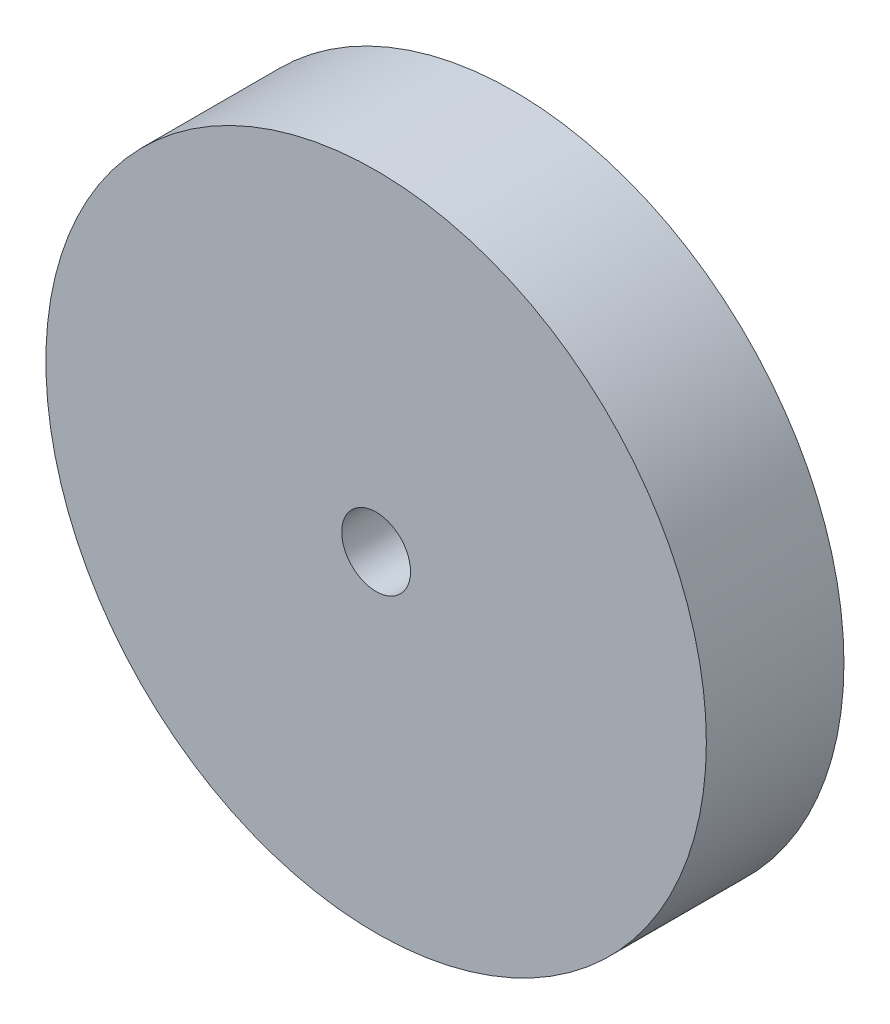
ISO-10303-21;
HEADER;
FILE_DESCRIPTION(('STEP AP214'),'2;1');
FILE_NAME('part.step','',(''),(''),'','','');
FILE_SCHEMA(('AUTOMOTIVE_DESIGN { 1 0 10303 214 1 1 1 1 }'));
ENDSEC;
DATA;
#1=APPLICATION_CONTEXT('core data for automotive mechanical design processes');
#2=APPLICATION_PROTOCOL_DEFINITION('international standard','automotive_design',2000,#1);
#3=PRODUCT_CONTEXT('',#1,'mechanical');
#4=PRODUCT('Part','Part','',(#3));
#5=PRODUCT_RELATED_PRODUCT_CATEGORY('part','',(#4));
#6=PRODUCT_DEFINITION_FORMATION('','',#4);
#7=PRODUCT_DEFINITION_CONTEXT('part definition',#1,'design');
#8=PRODUCT_DEFINITION('design','',#6,#7);
#9=PRODUCT_DEFINITION_SHAPE('','',#8);
#10=(LENGTH_UNIT() NAMED_UNIT(*) SI_UNIT(.MILLI.,.METRE.));
#11=(NAMED_UNIT(*) PLANE_ANGLE_UNIT() SI_UNIT($,.RADIAN.));
#12=(NAMED_UNIT(*) SI_UNIT($,.STERADIAN.) SOLID_ANGLE_UNIT());
#13=UNCERTAINTY_MEASURE_WITH_UNIT(LENGTH_MEASURE(1.E-05),#10,'distance_accuracy_value','');
#14=(GEOMETRIC_REPRESENTATION_CONTEXT(3) GLOBAL_UNCERTAINTY_ASSIGNED_CONTEXT((#13)) GLOBAL_UNIT_ASSIGNED_CONTEXT((#10,
#11,#12)) REPRESENTATION_CONTEXT('',''));
#15=CARTESIAN_POINT('',(0.,0.,0.));
#16=DIRECTION('',(0.,0.,1.));
#17=DIRECTION('',(1.,0.,0.));
#18=AXIS2_PLACEMENT_3D('',#15,#16,#17);
#19=CARTESIAN_POINT('',(0.,0.,6.35));
#20=DIRECTION('',(0.,0.,1.));
#21=DIRECTION('',(1.,0.,0.));
#22=AXIS2_PLACEMENT_3D('',#19,#20,#21);
#23=PLANE('',#22);
#24=CARTESIAN_POINT('',(0.,0.,6.35));
#25=DIRECTION('',(0.,0.,1.));
#26=DIRECTION('',(1.,0.,0.));
#27=AXIS2_PLACEMENT_3D('',#24,#25,#26);
#28=CIRCLE('',#27,15.24);
#29=CARTESIAN_POINT('',(15.24,0.,6.35));
#30=VERTEX_POINT('',#29);
#31=EDGE_CURVE('E10',#30,#30,#28,.T.);
#32=ORIENTED_EDGE('',*,*,#31,.T.);
#33=EDGE_LOOP('',(#32));
#34=FACE_BOUND('',#33,.T.);
#35=CARTESIAN_POINT('',(0.,0.,6.35));
#36=DIRECTION('',(0.,0.,1.));
#37=DIRECTION('',(1.,0.,0.));
#38=AXIS2_PLACEMENT_3D('',#35,#36,#37);
#39=CIRCLE('',#38,1.5875);
#40=CARTESIAN_POINT('',(1.5875,0.,6.35));
#41=VERTEX_POINT('',#40);
#42=EDGE_CURVE('E50',#41,#41,#39,.T.);
#43=ORIENTED_EDGE('',*,*,#42,.F.);
#44=EDGE_LOOP('',(#43));
#45=FACE_BOUND('',#44,.T.);
#46=ADVANCED_FACE('F37',(#34,#45),#23,.T.);
#47=CARTESIAN_POINT('',(0.,0.,0.));
#48=DIRECTION('',(0.,0.,1.));
#49=DIRECTION('',(1.,0.,0.));
#50=AXIS2_PLACEMENT_3D('',#47,#48,#49);
#51=PLANE('',#50);
#52=CARTESIAN_POINT('',(0.,0.,0.));
#53=DIRECTION('',(0.,0.,1.));
#54=DIRECTION('',(1.,0.,0.));
#55=AXIS2_PLACEMENT_3D('',#52,#53,#54);
#56=CIRCLE('',#55,15.24);
#57=CARTESIAN_POINT('',(15.24,0.,0.));
#58=VERTEX_POINT('',#57);
#59=EDGE_CURVE('E41',#58,#58,#56,.T.);
#60=ORIENTED_EDGE('',*,*,#59,.F.);
#61=EDGE_LOOP('',(#60));
#62=FACE_BOUND('',#61,.T.);
#63=CARTESIAN_POINT('',(0.,0.,0.));
#64=DIRECTION('',(0.,0.,1.));
#65=DIRECTION('',(1.,0.,0.));
#66=AXIS2_PLACEMENT_3D('',#63,#64,#65);
#67=CIRCLE('',#66,1.5875);
#68=CARTESIAN_POINT('',(1.5875,0.,0.));
#69=VERTEX_POINT('',#68);
#70=EDGE_CURVE('E52',#69,#69,#67,.T.);
#71=ORIENTED_EDGE('',*,*,#70,.T.);
#72=EDGE_LOOP('',(#71));
#73=FACE_BOUND('',#72,.T.);
#74=ADVANCED_FACE('F64',(#62,#73),#51,.F.);
#75=CARTESIAN_POINT('',(0.,0.,6.35));
#76=DIRECTION('',(0.,0.,-1.));
#77=DIRECTION('',(-1.,0.,0.));
#78=AXIS2_PLACEMENT_3D('',#75,#76,#77);
#79=CYLINDRICAL_SURFACE('',#78,15.24);
#80=ORIENTED_EDGE('',*,*,#31,.F.);
#81=EDGE_LOOP('',(#80));
#82=FACE_BOUND('',#81,.T.);
#83=ORIENTED_EDGE('',*,*,#59,.T.);
#84=EDGE_LOOP('',(#83));
#85=FACE_BOUND('',#84,.T.);
#86=ADVANCED_FACE('F39',(#82,#85),#79,.T.);
#87=CARTESIAN_POINT('',(0.,0.,6.35));
#88=DIRECTION('',(0.,0.,-1.));
#89=DIRECTION('',(-1.,0.,0.));
#90=AXIS2_PLACEMENT_3D('',#87,#88,#89);
#91=CYLINDRICAL_SURFACE('',#90,1.5875);
#92=ORIENTED_EDGE('',*,*,#42,.T.);
#93=EDGE_LOOP('',(#92));
#94=FACE_BOUND('',#93,.T.);
#95=ORIENTED_EDGE('',*,*,#70,.F.);
#96=EDGE_LOOP('',(#95));
#97=FACE_BOUND('',#96,.T.);
#98=ADVANCED_FACE('F60',(#94,#97),#91,.F.);
#99=CLOSED_SHELL('',(#46,#74,#86,#98));
#100=MANIFOLD_SOLID_BREP('B2',#99);
#101=ADVANCED_BREP_SHAPE_REPRESENTATION('',(#18,#100),#14);
#102=SHAPE_DEFINITION_REPRESENTATION(#9,#101);
ENDSEC;
END-ISO-10303-21;
